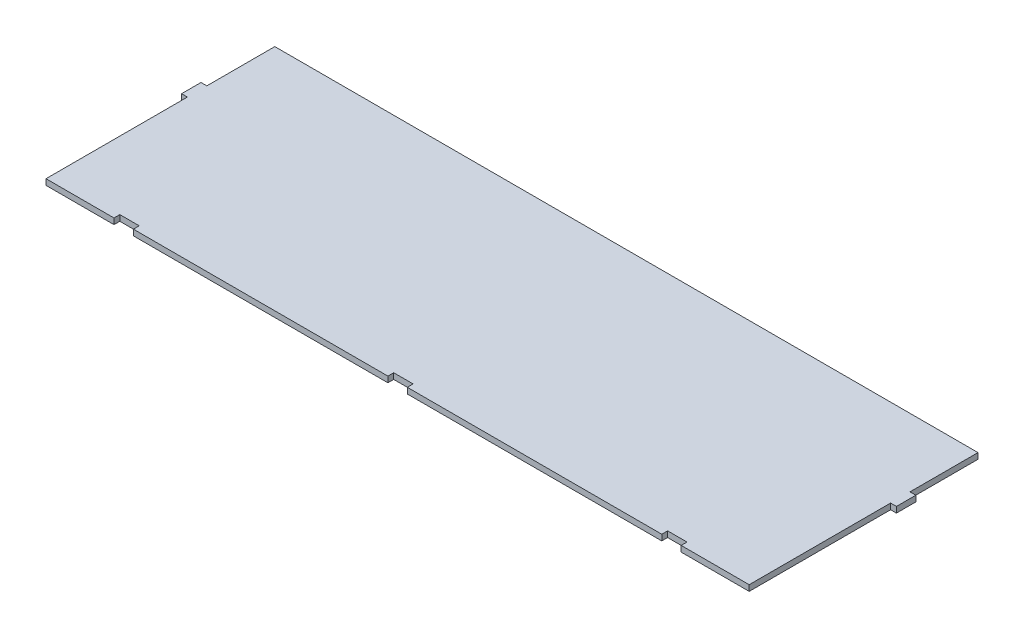
ISO-10303-21;
HEADER;
FILE_DESCRIPTION(('STEP AP214'),'2;1');
FILE_NAME('part.step','',(''),(''),'','','');
FILE_SCHEMA(('AUTOMOTIVE_DESIGN { 1 0 10303 214 1 1 1 1 }'));
ENDSEC;
DATA;
#1=APPLICATION_CONTEXT('core data for automotive mechanical design processes');
#2=APPLICATION_PROTOCOL_DEFINITION('international standard','automotive_design',2000,#1);
#3=PRODUCT_CONTEXT('',#1,'mechanical');
#4=PRODUCT('Part','Part','',(#3));
#5=PRODUCT_RELATED_PRODUCT_CATEGORY('part','',(#4));
#6=PRODUCT_DEFINITION_FORMATION('','',#4);
#7=PRODUCT_DEFINITION_CONTEXT('part definition',#1,'design');
#8=PRODUCT_DEFINITION('design','',#6,#7);
#9=PRODUCT_DEFINITION_SHAPE('','',#8);
#10=(LENGTH_UNIT() NAMED_UNIT(*) SI_UNIT(.MILLI.,.METRE.));
#11=(NAMED_UNIT(*) PLANE_ANGLE_UNIT() SI_UNIT($,.RADIAN.));
#12=(NAMED_UNIT(*) SI_UNIT($,.STERADIAN.) SOLID_ANGLE_UNIT());
#13=UNCERTAINTY_MEASURE_WITH_UNIT(LENGTH_MEASURE(1.E-05),#10,'distance_accuracy_value','');
#14=(GEOMETRIC_REPRESENTATION_CONTEXT(3) GLOBAL_UNCERTAINTY_ASSIGNED_CONTEXT((#13)) GLOBAL_UNIT_ASSIGNED_CONTEXT((#10,
#11,#12)) REPRESENTATION_CONTEXT('',''));
#15=CARTESIAN_POINT('',(0.,0.,0.));
#16=DIRECTION('',(0.,0.,1.));
#17=DIRECTION('',(1.,0.,0.));
#18=AXIS2_PLACEMENT_3D('',#15,#16,#17);
#19=CARTESIAN_POINT('',(-146.,3.,49.095));
#20=DIRECTION('',(0.,0.,-1.));
#21=DIRECTION('',(-1.,0.,0.));
#22=AXIS2_PLACEMENT_3D('',#19,#20,#21);
#23=PLANE('',#22);
#24=DIRECTION('',(1.,0.,0.));
#25=VECTOR('',#24,1.);
#26=CARTESIAN_POINT('',(-146.,0.,49.095));
#27=LINE('',#26,#25);
#28=CARTESIAN_POINT('',(-181.,0.,49.095));
#29=VERTEX_POINT('',#28);
#30=CARTESIAN_POINT('',(-146.,0.,49.095));
#31=VERTEX_POINT('',#30);
#32=EDGE_CURVE('E228',#29,#31,#27,.T.);
#33=ORIENTED_EDGE('',*,*,#32,.T.);
#34=DIRECTION('',(0.,-1.,0.));
#35=VECTOR('',#34,1.);
#36=CARTESIAN_POINT('',(-146.,3.,49.095));
#37=LINE('',#36,#35);
#38=CARTESIAN_POINT('',(-146.,3.,49.095));
#39=VERTEX_POINT('',#38);
#40=EDGE_CURVE('E11',#39,#31,#37,.T.);
#41=ORIENTED_EDGE('',*,*,#40,.F.);
#42=DIRECTION('',(1.,0.,0.));
#43=VECTOR('',#42,1.);
#44=CARTESIAN_POINT('',(-146.,3.,49.095));
#45=LINE('',#44,#43);
#46=CARTESIAN_POINT('',(-181.,3.,49.095));
#47=VERTEX_POINT('',#46);
#48=EDGE_CURVE('E274',#47,#39,#45,.T.);
#49=ORIENTED_EDGE('',*,*,#48,.F.);
#50=DIRECTION('',(0.,-1.,0.));
#51=VECTOR('',#50,1.);
#52=CARTESIAN_POINT('',(-181.,3.,49.095));
#53=LINE('',#52,#51);
#54=EDGE_CURVE('E224',#47,#29,#53,.T.);
#55=ORIENTED_EDGE('',*,*,#54,.T.);
#56=EDGE_LOOP('',(#33,#41,#49,#55));
#57=FACE_BOUND('',#56,.T.);
#58=ADVANCED_FACE('F36',(#57),#23,.F.);
#59=CARTESIAN_POINT('',(-146.,3.,49.095));
#60=DIRECTION('',(-1.,0.,0.));
#61=DIRECTION('',(0.,0.,1.));
#62=AXIS2_PLACEMENT_3D('',#59,#60,#61);
#63=PLANE('',#62);
#64=DIRECTION('',(0.,0.,-1.));
#65=VECTOR('',#64,1.);
#66=CARTESIAN_POINT('',(-146.,0.,49.095));
#67=LINE('',#66,#65);
#68=CARTESIAN_POINT('',(-146.,0.,46.095));
#69=VERTEX_POINT('',#68);
#70=EDGE_CURVE('E231',#31,#69,#67,.T.);
#71=ORIENTED_EDGE('',*,*,#70,.T.);
#72=DIRECTION('',(0.,-1.,0.));
#73=VECTOR('',#72,1.);
#74=CARTESIAN_POINT('',(-146.,3.,46.095));
#75=LINE('',#74,#73);
#76=CARTESIAN_POINT('',(-146.,3.,46.095));
#77=VERTEX_POINT('',#76);
#78=EDGE_CURVE('E44',#77,#69,#75,.T.);
#79=ORIENTED_EDGE('',*,*,#78,.F.);
#80=DIRECTION('',(0.,0.,-1.));
#81=VECTOR('',#80,1.);
#82=CARTESIAN_POINT('',(-146.,3.,49.095));
#83=LINE('',#82,#81);
#84=EDGE_CURVE('E143',#39,#77,#83,.T.);
#85=ORIENTED_EDGE('',*,*,#84,.F.);
#86=ORIENTED_EDGE('',*,*,#40,.T.);
#87=EDGE_LOOP('',(#71,#79,#85,#86));
#88=FACE_BOUND('',#87,.T.);
#89=ADVANCED_FACE('F412',(#88),#63,.F.);
#90=CARTESIAN_POINT('',(-146.,3.,46.095));
#91=DIRECTION('',(0.,0.,-1.));
#92=DIRECTION('',(-1.,0.,0.));
#93=AXIS2_PLACEMENT_3D('',#90,#91,#92);
#94=PLANE('',#93);
#95=DIRECTION('',(1.,0.,0.));
#96=VECTOR('',#95,1.);
#97=CARTESIAN_POINT('',(-146.,0.,46.095));
#98=LINE('',#97,#96);
#99=CARTESIAN_POINT('',(-136.,0.,46.095));
#100=VERTEX_POINT('',#99);
#101=EDGE_CURVE('E233',#69,#100,#98,.T.);
#102=ORIENTED_EDGE('',*,*,#101,.T.);
#103=DIRECTION('',(0.,-1.,0.));
#104=VECTOR('',#103,1.);
#105=CARTESIAN_POINT('',(-136.,3.,46.095));
#106=LINE('',#105,#104);
#107=CARTESIAN_POINT('',(-136.,3.,46.095));
#108=VERTEX_POINT('',#107);
#109=EDGE_CURVE('E329',#108,#100,#106,.T.);
#110=ORIENTED_EDGE('',*,*,#109,.F.);
#111=DIRECTION('',(1.,0.,0.));
#112=VECTOR('',#111,1.);
#113=CARTESIAN_POINT('',(-146.,3.,46.095));
#114=LINE('',#113,#112);
#115=EDGE_CURVE('E337',#77,#108,#114,.T.);
#116=ORIENTED_EDGE('',*,*,#115,.F.);
#117=ORIENTED_EDGE('',*,*,#78,.T.);
#118=EDGE_LOOP('',(#102,#110,#116,#117));
#119=FACE_BOUND('',#118,.T.);
#120=ADVANCED_FACE('F335',(#119),#94,.F.);
#121=CARTESIAN_POINT('',(-136.,3.,46.095));
#122=DIRECTION('',(1.,0.,0.));
#123=DIRECTION('',(0.,0.,-1.));
#124=AXIS2_PLACEMENT_3D('',#121,#122,#123);
#125=PLANE('',#124);
#126=DIRECTION('',(0.,0.,1.));
#127=VECTOR('',#126,1.);
#128=CARTESIAN_POINT('',(-136.,0.,46.095));
#129=LINE('',#128,#127);
#130=CARTESIAN_POINT('',(-136.,0.,49.095));
#131=VERTEX_POINT('',#130);
#132=EDGE_CURVE('E235',#100,#131,#129,.T.);
#133=ORIENTED_EDGE('',*,*,#132,.T.);
#134=DIRECTION('',(0.,-1.,0.));
#135=VECTOR('',#134,1.);
#136=CARTESIAN_POINT('',(-136.,3.,49.095));
#137=LINE('',#136,#135);
#138=CARTESIAN_POINT('',(-136.,3.,49.095));
#139=VERTEX_POINT('',#138);
#140=EDGE_CURVE('E326',#139,#131,#137,.T.);
#141=ORIENTED_EDGE('',*,*,#140,.F.);
#142=DIRECTION('',(0.,0.,1.));
#143=VECTOR('',#142,1.);
#144=CARTESIAN_POINT('',(-136.,3.,46.095));
#145=LINE('',#144,#143);
#146=EDGE_CURVE('E355',#108,#139,#145,.T.);
#147=ORIENTED_EDGE('',*,*,#146,.F.);
#148=ORIENTED_EDGE('',*,*,#109,.T.);
#149=EDGE_LOOP('',(#133,#141,#147,#148));
#150=FACE_BOUND('',#149,.T.);
#151=ADVANCED_FACE('F346',(#150),#125,.F.);
#152=CARTESIAN_POINT('',(-5.00000000000006,3.,49.095));
#153=DIRECTION('',(0.,0.,-1.));
#154=DIRECTION('',(-1.,0.,0.));
#155=AXIS2_PLACEMENT_3D('',#152,#153,#154);
#156=PLANE('',#155);
#157=DIRECTION('',(1.,0.,0.));
#158=VECTOR('',#157,1.);
#159=CARTESIAN_POINT('',(-5.00000000000006,0.,49.095));
#160=LINE('',#159,#158);
#161=CARTESIAN_POINT('',(-5.00000000000006,0.,49.095));
#162=VERTEX_POINT('',#161);
#163=EDGE_CURVE('E237',#131,#162,#160,.T.);
#164=ORIENTED_EDGE('',*,*,#163,.T.);
#165=DIRECTION('',(0.,-1.,0.));
#166=VECTOR('',#165,1.);
#167=CARTESIAN_POINT('',(-5.00000000000006,3.,49.095));
#168=LINE('',#167,#166);
#169=CARTESIAN_POINT('',(-5.00000000000006,3.,49.095));
#170=VERTEX_POINT('',#169);
#171=EDGE_CURVE('E323',#170,#162,#168,.T.);
#172=ORIENTED_EDGE('',*,*,#171,.F.);
#173=DIRECTION('',(1.,0.,0.));
#174=VECTOR('',#173,1.);
#175=CARTESIAN_POINT('',(-5.00000000000006,3.,49.095));
#176=LINE('',#175,#174);
#177=EDGE_CURVE('E352',#139,#170,#176,.T.);
#178=ORIENTED_EDGE('',*,*,#177,.F.);
#179=ORIENTED_EDGE('',*,*,#140,.T.);
#180=EDGE_LOOP('',(#164,#172,#178,#179));
#181=FACE_BOUND('',#180,.T.);
#182=ADVANCED_FACE('F350',(#181),#156,.F.);
#183=CARTESIAN_POINT('',(-5.00000000000006,3.,46.095));
#184=DIRECTION('',(-1.,0.,0.));
#185=DIRECTION('',(0.,0.,1.));
#186=AXIS2_PLACEMENT_3D('',#183,#184,#185);
#187=PLANE('',#186);
#188=DIRECTION('',(0.,0.,-1.));
#189=VECTOR('',#188,1.);
#190=CARTESIAN_POINT('',(-5.00000000000006,0.,46.095));
#191=LINE('',#190,#189);
#192=CARTESIAN_POINT('',(-5.00000000000006,0.,46.095));
#193=VERTEX_POINT('',#192);
#194=EDGE_CURVE('E239',#162,#193,#191,.T.);
#195=ORIENTED_EDGE('',*,*,#194,.T.);
#196=DIRECTION('',(0.,-1.,0.));
#197=VECTOR('',#196,1.);
#198=CARTESIAN_POINT('',(-5.00000000000006,3.,46.095));
#199=LINE('',#198,#197);
#200=CARTESIAN_POINT('',(-5.00000000000006,3.,46.095));
#201=VERTEX_POINT('',#200);
#202=EDGE_CURVE('E320',#201,#193,#199,.T.);
#203=ORIENTED_EDGE('',*,*,#202,.F.);
#204=DIRECTION('',(0.,0.,-1.));
#205=VECTOR('',#204,1.);
#206=CARTESIAN_POINT('',(-5.00000000000006,3.,46.095));
#207=LINE('',#206,#205);
#208=EDGE_CURVE('E354',#170,#201,#207,.T.);
#209=ORIENTED_EDGE('',*,*,#208,.F.);
#210=ORIENTED_EDGE('',*,*,#171,.T.);
#211=EDGE_LOOP('',(#195,#203,#209,#210));
#212=FACE_BOUND('',#211,.T.);
#213=ADVANCED_FACE('F425',(#212),#187,.F.);
#214=CARTESIAN_POINT('',(-5.00000000000006,3.,46.095));
#215=DIRECTION('',(0.,0.,-1.));
#216=DIRECTION('',(-1.,0.,0.));
#217=AXIS2_PLACEMENT_3D('',#214,#215,#216);
#218=PLANE('',#217);
#219=DIRECTION('',(1.,0.,0.));
#220=VECTOR('',#219,1.);
#221=CARTESIAN_POINT('',(-5.00000000000006,0.,46.095));
#222=LINE('',#221,#220);
#223=CARTESIAN_POINT('',(4.99999999999994,0.,46.095));
#224=VERTEX_POINT('',#223);
#225=EDGE_CURVE('E241',#193,#224,#222,.T.);
#226=ORIENTED_EDGE('',*,*,#225,.T.);
#227=DIRECTION('',(0.,-1.,0.));
#228=VECTOR('',#227,1.);
#229=CARTESIAN_POINT('',(4.99999999999994,3.,46.095));
#230=LINE('',#229,#228);
#231=CARTESIAN_POINT('',(4.99999999999994,3.,46.095));
#232=VERTEX_POINT('',#231);
#233=EDGE_CURVE('E317',#232,#224,#230,.T.);
#234=ORIENTED_EDGE('',*,*,#233,.F.);
#235=DIRECTION('',(1.,0.,0.));
#236=VECTOR('',#235,1.);
#237=CARTESIAN_POINT('',(-5.00000000000006,3.,46.095));
#238=LINE('',#237,#236);
#239=EDGE_CURVE('E357',#201,#232,#238,.T.);
#240=ORIENTED_EDGE('',*,*,#239,.F.);
#241=ORIENTED_EDGE('',*,*,#202,.T.);
#242=EDGE_LOOP('',(#226,#234,#240,#241));
#243=FACE_BOUND('',#242,.T.);
#244=ADVANCED_FACE('F428',(#243),#218,.F.);
#245=CARTESIAN_POINT('',(4.99999999999994,3.,46.095));
#246=DIRECTION('',(1.,0.,0.));
#247=DIRECTION('',(0.,0.,-1.));
#248=AXIS2_PLACEMENT_3D('',#245,#246,#247);
#249=PLANE('',#248);
#250=DIRECTION('',(0.,0.,1.));
#251=VECTOR('',#250,1.);
#252=CARTESIAN_POINT('',(4.99999999999994,0.,46.095));
#253=LINE('',#252,#251);
#254=CARTESIAN_POINT('',(4.99999999999994,0.,49.095));
#255=VERTEX_POINT('',#254);
#256=EDGE_CURVE('E243',#224,#255,#253,.T.);
#257=ORIENTED_EDGE('',*,*,#256,.T.);
#258=DIRECTION('',(0.,-1.,0.));
#259=VECTOR('',#258,1.);
#260=CARTESIAN_POINT('',(4.99999999999994,3.,49.095));
#261=LINE('',#260,#259);
#262=CARTESIAN_POINT('',(4.99999999999994,3.,49.095));
#263=VERTEX_POINT('',#262);
#264=EDGE_CURVE('E314',#263,#255,#261,.T.);
#265=ORIENTED_EDGE('',*,*,#264,.F.);
#266=DIRECTION('',(0.,0.,1.));
#267=VECTOR('',#266,1.);
#268=CARTESIAN_POINT('',(4.99999999999994,3.,46.095));
#269=LINE('',#268,#267);
#270=EDGE_CURVE('E363',#232,#263,#269,.T.);
#271=ORIENTED_EDGE('',*,*,#270,.F.);
#272=ORIENTED_EDGE('',*,*,#233,.T.);
#273=EDGE_LOOP('',(#257,#265,#271,#272));
#274=FACE_BOUND('',#273,.T.);
#275=ADVANCED_FACE('F432',(#274),#249,.F.);
#276=CARTESIAN_POINT('',(136.,3.,49.095));
#277=DIRECTION('',(0.,0.,-1.));
#278=DIRECTION('',(-1.,0.,0.));
#279=AXIS2_PLACEMENT_3D('',#276,#277,#278);
#280=PLANE('',#279);
#281=DIRECTION('',(1.,0.,0.));
#282=VECTOR('',#281,1.);
#283=CARTESIAN_POINT('',(136.,0.,49.095));
#284=LINE('',#283,#282);
#285=CARTESIAN_POINT('',(136.,0.,49.095));
#286=VERTEX_POINT('',#285);
#287=EDGE_CURVE('E245',#255,#286,#284,.T.);
#288=ORIENTED_EDGE('',*,*,#287,.T.);
#289=DIRECTION('',(0.,-1.,0.));
#290=VECTOR('',#289,1.);
#291=CARTESIAN_POINT('',(136.,3.,49.095));
#292=LINE('',#291,#290);
#293=CARTESIAN_POINT('',(136.,3.,49.095));
#294=VERTEX_POINT('',#293);
#295=EDGE_CURVE('E311',#294,#286,#292,.T.);
#296=ORIENTED_EDGE('',*,*,#295,.F.);
#297=DIRECTION('',(1.,0.,0.));
#298=VECTOR('',#297,1.);
#299=CARTESIAN_POINT('',(136.,3.,49.095));
#300=LINE('',#299,#298);
#301=EDGE_CURVE('E365',#263,#294,#300,.T.);
#302=ORIENTED_EDGE('',*,*,#301,.F.);
#303=ORIENTED_EDGE('',*,*,#264,.T.);
#304=EDGE_LOOP('',(#288,#296,#302,#303));
#305=FACE_BOUND('',#304,.T.);
#306=ADVANCED_FACE('F436',(#305),#280,.F.);
#307=CARTESIAN_POINT('',(136.,3.,46.095));
#308=DIRECTION('',(-1.,0.,0.));
#309=DIRECTION('',(0.,0.,1.));
#310=AXIS2_PLACEMENT_3D('',#307,#308,#309);
#311=PLANE('',#310);
#312=DIRECTION('',(0.,0.,-1.));
#313=VECTOR('',#312,1.);
#314=CARTESIAN_POINT('',(136.,0.,46.095));
#315=LINE('',#314,#313);
#316=CARTESIAN_POINT('',(136.,0.,46.095));
#317=VERTEX_POINT('',#316);
#318=EDGE_CURVE('E247',#286,#317,#315,.T.);
#319=ORIENTED_EDGE('',*,*,#318,.T.);
#320=DIRECTION('',(0.,-1.,0.));
#321=VECTOR('',#320,1.);
#322=CARTESIAN_POINT('',(136.,3.,46.095));
#323=LINE('',#322,#321);
#324=CARTESIAN_POINT('',(136.,3.,46.095));
#325=VERTEX_POINT('',#324);
#326=EDGE_CURVE('E308',#325,#317,#323,.T.);
#327=ORIENTED_EDGE('',*,*,#326,.F.);
#328=DIRECTION('',(0.,0.,-1.));
#329=VECTOR('',#328,1.);
#330=CARTESIAN_POINT('',(136.,3.,46.095));
#331=LINE('',#330,#329);
#332=EDGE_CURVE('E367',#294,#325,#331,.T.);
#333=ORIENTED_EDGE('',*,*,#332,.F.);
#334=ORIENTED_EDGE('',*,*,#295,.T.);
#335=EDGE_LOOP('',(#319,#327,#333,#334));
#336=FACE_BOUND('',#335,.T.);
#337=ADVANCED_FACE('F440',(#336),#311,.F.);
#338=CARTESIAN_POINT('',(146.,3.,46.095));
#339=DIRECTION('',(0.,0.,-1.));
#340=DIRECTION('',(-1.,0.,0.));
#341=AXIS2_PLACEMENT_3D('',#338,#339,#340);
#342=PLANE('',#341);
#343=DIRECTION('',(1.,0.,0.));
#344=VECTOR('',#343,1.);
#345=CARTESIAN_POINT('',(146.,0.,46.095));
#346=LINE('',#345,#344);
#347=CARTESIAN_POINT('',(146.,0.,46.095));
#348=VERTEX_POINT('',#347);
#349=EDGE_CURVE('E249',#317,#348,#346,.T.);
#350=ORIENTED_EDGE('',*,*,#349,.T.);
#351=DIRECTION('',(0.,-1.,0.));
#352=VECTOR('',#351,1.);
#353=CARTESIAN_POINT('',(146.,3.,46.095));
#354=LINE('',#353,#352);
#355=CARTESIAN_POINT('',(146.,3.,46.095));
#356=VERTEX_POINT('',#355);
#357=EDGE_CURVE('E305',#356,#348,#354,.T.);
#358=ORIENTED_EDGE('',*,*,#357,.F.);
#359=DIRECTION('',(1.,0.,0.));
#360=VECTOR('',#359,1.);
#361=CARTESIAN_POINT('',(146.,3.,46.095));
#362=LINE('',#361,#360);
#363=EDGE_CURVE('E369',#325,#356,#362,.T.);
#364=ORIENTED_EDGE('',*,*,#363,.F.);
#365=ORIENTED_EDGE('',*,*,#326,.T.);
#366=EDGE_LOOP('',(#350,#358,#364,#365));
#367=FACE_BOUND('',#366,.T.);
#368=ADVANCED_FACE('F444',(#367),#342,.F.);
#369=CARTESIAN_POINT('',(146.,3.,49.095));
#370=DIRECTION('',(1.,0.,0.));
#371=DIRECTION('',(0.,0.,-1.));
#372=AXIS2_PLACEMENT_3D('',#369,#370,#371);
#373=PLANE('',#372);
#374=DIRECTION('',(0.,0.,1.));
#375=VECTOR('',#374,1.);
#376=CARTESIAN_POINT('',(146.,0.,49.095));
#377=LINE('',#376,#375);
#378=CARTESIAN_POINT('',(146.,0.,49.095));
#379=VERTEX_POINT('',#378);
#380=EDGE_CURVE('E251',#348,#379,#377,.T.);
#381=ORIENTED_EDGE('',*,*,#380,.T.);
#382=DIRECTION('',(0.,-1.,0.));
#383=VECTOR('',#382,1.);
#384=CARTESIAN_POINT('',(146.,3.,49.095));
#385=LINE('',#384,#383);
#386=CARTESIAN_POINT('',(146.,3.,49.095));
#387=VERTEX_POINT('',#386);
#388=EDGE_CURVE('E302',#387,#379,#385,.T.);
#389=ORIENTED_EDGE('',*,*,#388,.F.);
#390=DIRECTION('',(0.,0.,1.));
#391=VECTOR('',#390,1.);
#392=CARTESIAN_POINT('',(146.,3.,49.095));
#393=LINE('',#392,#391);
#394=EDGE_CURVE('E371',#356,#387,#393,.T.);
#395=ORIENTED_EDGE('',*,*,#394,.F.);
#396=ORIENTED_EDGE('',*,*,#357,.T.);
#397=EDGE_LOOP('',(#381,#389,#395,#396));
#398=FACE_BOUND('',#397,.T.);
#399=ADVANCED_FACE('F448',(#398),#373,.F.);
#400=CARTESIAN_POINT('',(181.,3.,49.095));
#401=DIRECTION('',(0.,0.,-1.));
#402=DIRECTION('',(-1.,0.,0.));
#403=AXIS2_PLACEMENT_3D('',#400,#401,#402);
#404=PLANE('',#403);
#405=DIRECTION('',(1.,0.,0.));
#406=VECTOR('',#405,1.);
#407=CARTESIAN_POINT('',(181.,0.,49.095));
#408=LINE('',#407,#406);
#409=CARTESIAN_POINT('',(181.,0.,49.095));
#410=VERTEX_POINT('',#409);
#411=EDGE_CURVE('E253',#379,#410,#408,.T.);
#412=ORIENTED_EDGE('',*,*,#411,.T.);
#413=DIRECTION('',(0.,-1.,0.));
#414=VECTOR('',#413,1.);
#415=CARTESIAN_POINT('',(181.,3.,49.095));
#416=LINE('',#415,#414);
#417=CARTESIAN_POINT('',(181.,3.,49.095));
#418=VERTEX_POINT('',#417);
#419=EDGE_CURVE('E299',#418,#410,#416,.T.);
#420=ORIENTED_EDGE('',*,*,#419,.F.);
#421=DIRECTION('',(1.,0.,0.));
#422=VECTOR('',#421,1.);
#423=CARTESIAN_POINT('',(181.,3.,49.095));
#424=LINE('',#423,#422);
#425=EDGE_CURVE('E373',#387,#418,#424,.T.);
#426=ORIENTED_EDGE('',*,*,#425,.F.);
#427=ORIENTED_EDGE('',*,*,#388,.T.);
#428=EDGE_LOOP('',(#412,#420,#426,#427));
#429=FACE_BOUND('',#428,.T.);
#430=ADVANCED_FACE('F452',(#429),#404,.F.);
#431=CARTESIAN_POINT('',(181.,3.,-23.695));
#432=DIRECTION('',(-1.,0.,0.));
#433=DIRECTION('',(0.,0.,1.));
#434=AXIS2_PLACEMENT_3D('',#431,#432,#433);
#435=PLANE('',#434);
#436=DIRECTION('',(0.,0.,-1.));
#437=VECTOR('',#436,1.);
#438=CARTESIAN_POINT('',(181.,0.,-23.695));
#439=LINE('',#438,#437);
#440=CARTESIAN_POINT('',(181.,0.,-23.695));
#441=VERTEX_POINT('',#440);
#442=EDGE_CURVE('E255',#410,#441,#439,.T.);
#443=ORIENTED_EDGE('',*,*,#442,.T.);
#444=DIRECTION('',(0.,-1.,0.));
#445=VECTOR('',#444,1.);
#446=CARTESIAN_POINT('',(181.,3.,-23.695));
#447=LINE('',#446,#445);
#448=CARTESIAN_POINT('',(181.,3.,-23.695));
#449=VERTEX_POINT('',#448);
#450=EDGE_CURVE('E296',#449,#441,#447,.T.);
#451=ORIENTED_EDGE('',*,*,#450,.F.);
#452=DIRECTION('',(0.,0.,-1.));
#453=VECTOR('',#452,1.);
#454=CARTESIAN_POINT('',(181.,3.,-23.695));
#455=LINE('',#454,#453);
#456=EDGE_CURVE('E375',#418,#449,#455,.T.);
#457=ORIENTED_EDGE('',*,*,#456,.F.);
#458=ORIENTED_EDGE('',*,*,#419,.T.);
#459=EDGE_LOOP('',(#443,#451,#457,#458));
#460=FACE_BOUND('',#459,.T.);
#461=ADVANCED_FACE('F456',(#460),#435,.F.);
#462=CARTESIAN_POINT('',(181.,3.,-23.695));
#463=DIRECTION('',(0.,0.,-1.));
#464=DIRECTION('',(-1.,0.,0.));
#465=AXIS2_PLACEMENT_3D('',#462,#463,#464);
#466=PLANE('',#465);
#467=DIRECTION('',(1.,0.,0.));
#468=VECTOR('',#467,1.);
#469=CARTESIAN_POINT('',(181.,0.,-23.695));
#470=LINE('',#469,#468);
#471=CARTESIAN_POINT('',(184.,0.,-23.695));
#472=VERTEX_POINT('',#471);
#473=EDGE_CURVE('E257',#441,#472,#470,.T.);
#474=ORIENTED_EDGE('',*,*,#473,.T.);
#475=DIRECTION('',(0.,-1.,0.));
#476=VECTOR('',#475,1.);
#477=CARTESIAN_POINT('',(184.,3.,-23.695));
#478=LINE('',#477,#476);
#479=CARTESIAN_POINT('',(184.,3.,-23.695));
#480=VERTEX_POINT('',#479);
#481=EDGE_CURVE('E293',#480,#472,#478,.T.);
#482=ORIENTED_EDGE('',*,*,#481,.F.);
#483=DIRECTION('',(1.,0.,0.));
#484=VECTOR('',#483,1.);
#485=CARTESIAN_POINT('',(181.,3.,-23.695));
#486=LINE('',#485,#484);
#487=EDGE_CURVE('E377',#449,#480,#486,.T.);
#488=ORIENTED_EDGE('',*,*,#487,.F.);
#489=ORIENTED_EDGE('',*,*,#450,.T.);
#490=EDGE_LOOP('',(#474,#482,#488,#489));
#491=FACE_BOUND('',#490,.T.);
#492=ADVANCED_FACE('F460',(#491),#466,.F.);
#493=CARTESIAN_POINT('',(184.,3.,-33.695));
#494=DIRECTION('',(-1.,0.,0.));
#495=DIRECTION('',(0.,0.,1.));
#496=AXIS2_PLACEMENT_3D('',#493,#494,#495);
#497=PLANE('',#496);
#498=DIRECTION('',(0.,0.,-1.));
#499=VECTOR('',#498,1.);
#500=CARTESIAN_POINT('',(184.,0.,-33.695));
#501=LINE('',#500,#499);
#502=CARTESIAN_POINT('',(184.,0.,-33.695));
#503=VERTEX_POINT('',#502);
#504=EDGE_CURVE('E259',#472,#503,#501,.T.);
#505=ORIENTED_EDGE('',*,*,#504,.T.);
#506=DIRECTION('',(0.,-1.,0.));
#507=VECTOR('',#506,1.);
#508=CARTESIAN_POINT('',(184.,3.,-33.695));
#509=LINE('',#508,#507);
#510=CARTESIAN_POINT('',(184.,3.,-33.695));
#511=VERTEX_POINT('',#510);
#512=EDGE_CURVE('E290',#511,#503,#509,.T.);
#513=ORIENTED_EDGE('',*,*,#512,.F.);
#514=DIRECTION('',(0.,0.,-1.));
#515=VECTOR('',#514,1.);
#516=CARTESIAN_POINT('',(184.,3.,-33.695));
#517=LINE('',#516,#515);
#518=EDGE_CURVE('E379',#480,#511,#517,.T.);
#519=ORIENTED_EDGE('',*,*,#518,.F.);
#520=ORIENTED_EDGE('',*,*,#481,.T.);
#521=EDGE_LOOP('',(#505,#513,#519,#520));
#522=FACE_BOUND('',#521,.T.);
#523=ADVANCED_FACE('F464',(#522),#497,.F.);
#524=CARTESIAN_POINT('',(184.,3.,-33.695));
#525=DIRECTION('',(0.,0.,1.));
#526=DIRECTION('',(1.,0.,0.));
#527=AXIS2_PLACEMENT_3D('',#524,#525,#526);
#528=PLANE('',#527);
#529=DIRECTION('',(-1.,0.,0.));
#530=VECTOR('',#529,1.);
#531=CARTESIAN_POINT('',(184.,0.,-33.695));
#532=LINE('',#531,#530);
#533=CARTESIAN_POINT('',(181.,0.,-33.695));
#534=VERTEX_POINT('',#533);
#535=EDGE_CURVE('E261',#503,#534,#532,.T.);
#536=ORIENTED_EDGE('',*,*,#535,.T.);
#537=DIRECTION('',(0.,-1.,0.));
#538=VECTOR('',#537,1.);
#539=CARTESIAN_POINT('',(181.,3.,-33.695));
#540=LINE('',#539,#538);
#541=CARTESIAN_POINT('',(181.,3.,-33.695));
#542=VERTEX_POINT('',#541);
#543=EDGE_CURVE('E287',#542,#534,#540,.T.);
#544=ORIENTED_EDGE('',*,*,#543,.F.);
#545=DIRECTION('',(-1.,0.,0.));
#546=VECTOR('',#545,1.);
#547=CARTESIAN_POINT('',(184.,3.,-33.695));
#548=LINE('',#547,#546);
#549=EDGE_CURVE('E381',#511,#542,#548,.T.);
#550=ORIENTED_EDGE('',*,*,#549,.F.);
#551=ORIENTED_EDGE('',*,*,#512,.T.);
#552=EDGE_LOOP('',(#536,#544,#550,#551));
#553=FACE_BOUND('',#552,.T.);
#554=ADVANCED_FACE('F468',(#553),#528,.F.);
#555=CARTESIAN_POINT('',(181.,3.,-68.695));
#556=DIRECTION('',(-1.,0.,0.));
#557=DIRECTION('',(0.,0.,1.));
#558=AXIS2_PLACEMENT_3D('',#555,#556,#557);
#559=PLANE('',#558);
#560=DIRECTION('',(0.,0.,-1.));
#561=VECTOR('',#560,1.);
#562=CARTESIAN_POINT('',(181.,0.,-68.695));
#563=LINE('',#562,#561);
#564=CARTESIAN_POINT('',(181.,0.,-68.695));
#565=VERTEX_POINT('',#564);
#566=EDGE_CURVE('E263',#534,#565,#563,.T.);
#567=ORIENTED_EDGE('',*,*,#566,.T.);
#568=DIRECTION('',(0.,-1.,0.));
#569=VECTOR('',#568,1.);
#570=CARTESIAN_POINT('',(181.,3.,-68.695));
#571=LINE('',#570,#569);
#572=CARTESIAN_POINT('',(181.,3.,-68.695));
#573=VERTEX_POINT('',#572);
#574=EDGE_CURVE('E284',#573,#565,#571,.T.);
#575=ORIENTED_EDGE('',*,*,#574,.F.);
#576=DIRECTION('',(0.,0.,-1.));
#577=VECTOR('',#576,1.);
#578=CARTESIAN_POINT('',(181.,3.,-68.695));
#579=LINE('',#578,#577);
#580=EDGE_CURVE('E383',#542,#573,#579,.T.);
#581=ORIENTED_EDGE('',*,*,#580,.F.);
#582=ORIENTED_EDGE('',*,*,#543,.T.);
#583=EDGE_LOOP('',(#567,#575,#581,#582));
#584=FACE_BOUND('',#583,.T.);
#585=ADVANCED_FACE('F472',(#584),#559,.F.);
#586=CARTESIAN_POINT('',(181.,3.,-68.695));
#587=DIRECTION('',(0.,0.,1.));
#588=DIRECTION('',(1.,0.,0.));
#589=AXIS2_PLACEMENT_3D('',#586,#587,#588);
#590=PLANE('',#589);
#591=DIRECTION('',(-1.,0.,0.));
#592=VECTOR('',#591,1.);
#593=CARTESIAN_POINT('',(181.,0.,-68.695));
#594=LINE('',#593,#592);
#595=CARTESIAN_POINT('',(-181.,0.,-68.695));
#596=VERTEX_POINT('',#595);
#597=EDGE_CURVE('E265',#565,#596,#594,.T.);
#598=ORIENTED_EDGE('',*,*,#597,.T.);
#599=DIRECTION('',(0.,-1.,0.));
#600=VECTOR('',#599,1.);
#601=CARTESIAN_POINT('',(-181.,3.,-68.695));
#602=LINE('',#601,#600);
#603=CARTESIAN_POINT('',(-181.,3.,-68.695));
#604=VERTEX_POINT('',#603);
#605=EDGE_CURVE('E281',#604,#596,#602,.T.);
#606=ORIENTED_EDGE('',*,*,#605,.F.);
#607=DIRECTION('',(-1.,0.,0.));
#608=VECTOR('',#607,1.);
#609=CARTESIAN_POINT('',(181.,3.,-68.695));
#610=LINE('',#609,#608);
#611=EDGE_CURVE('E385',#573,#604,#610,.T.);
#612=ORIENTED_EDGE('',*,*,#611,.F.);
#613=ORIENTED_EDGE('',*,*,#574,.T.);
#614=EDGE_LOOP('',(#598,#606,#612,#613));
#615=FACE_BOUND('',#614,.T.);
#616=ADVANCED_FACE('F476',(#615),#590,.F.);
#617=CARTESIAN_POINT('',(-181.,3.,-68.695));
#618=DIRECTION('',(1.,0.,0.));
#619=DIRECTION('',(0.,0.,-1.));
#620=AXIS2_PLACEMENT_3D('',#617,#618,#619);
#621=PLANE('',#620);
#622=DIRECTION('',(0.,0.,1.));
#623=VECTOR('',#622,1.);
#624=CARTESIAN_POINT('',(-181.,0.,-68.695));
#625=LINE('',#624,#623);
#626=CARTESIAN_POINT('',(-181.,0.,-33.695));
#627=VERTEX_POINT('',#626);
#628=EDGE_CURVE('E267',#596,#627,#625,.T.);
#629=ORIENTED_EDGE('',*,*,#628,.T.);
#630=DIRECTION('',(0.,-1.,0.));
#631=VECTOR('',#630,1.);
#632=CARTESIAN_POINT('',(-181.,3.,-33.695));
#633=LINE('',#632,#631);
#634=CARTESIAN_POINT('',(-181.,3.,-33.695));
#635=VERTEX_POINT('',#634);
#636=EDGE_CURVE('E278',#635,#627,#633,.T.);
#637=ORIENTED_EDGE('',*,*,#636,.F.);
#638=DIRECTION('',(0.,0.,1.));
#639=VECTOR('',#638,1.);
#640=CARTESIAN_POINT('',(-181.,3.,-68.695));
#641=LINE('',#640,#639);
#642=EDGE_CURVE('E387',#604,#635,#641,.T.);
#643=ORIENTED_EDGE('',*,*,#642,.F.);
#644=ORIENTED_EDGE('',*,*,#605,.T.);
#645=EDGE_LOOP('',(#629,#637,#643,#644));
#646=FACE_BOUND('',#645,.T.);
#647=ADVANCED_FACE('F393',(#646),#621,.F.);
#648=CARTESIAN_POINT('',(-184.,3.,-33.695));
#649=DIRECTION('',(0.,0.,1.));
#650=DIRECTION('',(1.,0.,0.));
#651=AXIS2_PLACEMENT_3D('',#648,#649,#650);
#652=PLANE('',#651);
#653=DIRECTION('',(-1.,0.,0.));
#654=VECTOR('',#653,1.);
#655=CARTESIAN_POINT('',(-184.,0.,-33.695));
#656=LINE('',#655,#654);
#657=CARTESIAN_POINT('',(-184.,0.,-33.695));
#658=VERTEX_POINT('',#657);
#659=EDGE_CURVE('E269',#627,#658,#656,.T.);
#660=ORIENTED_EDGE('',*,*,#659,.T.);
#661=DIRECTION('',(0.,-1.,0.));
#662=VECTOR('',#661,1.);
#663=CARTESIAN_POINT('',(-184.,3.,-33.695));
#664=LINE('',#663,#662);
#665=CARTESIAN_POINT('',(-184.,3.,-33.695));
#666=VERTEX_POINT('',#665);
#667=EDGE_CURVE('E219',#666,#658,#664,.T.);
#668=ORIENTED_EDGE('',*,*,#667,.F.);
#669=DIRECTION('',(-1.,0.,0.));
#670=VECTOR('',#669,1.);
#671=CARTESIAN_POINT('',(-184.,3.,-33.695));
#672=LINE('',#671,#670);
#673=EDGE_CURVE('E210',#635,#666,#672,.T.);
#674=ORIENTED_EDGE('',*,*,#673,.F.);
#675=ORIENTED_EDGE('',*,*,#636,.T.);
#676=EDGE_LOOP('',(#660,#668,#674,#675));
#677=FACE_BOUND('',#676,.T.);
#678=ADVANCED_FACE('F397',(#677),#652,.F.);
#679=CARTESIAN_POINT('',(-184.,3.,-33.695));
#680=DIRECTION('',(1.,0.,0.));
#681=DIRECTION('',(0.,0.,-1.));
#682=AXIS2_PLACEMENT_3D('',#679,#680,#681);
#683=PLANE('',#682);
#684=DIRECTION('',(0.,0.,1.));
#685=VECTOR('',#684,1.);
#686=CARTESIAN_POINT('',(-184.,0.,-33.695));
#687=LINE('',#686,#685);
#688=CARTESIAN_POINT('',(-184.,0.,-23.695));
#689=VERTEX_POINT('',#688);
#690=EDGE_CURVE('E218',#658,#689,#687,.T.);
#691=ORIENTED_EDGE('',*,*,#690,.T.);
#692=DIRECTION('',(0.,-1.,0.));
#693=VECTOR('',#692,1.);
#694=CARTESIAN_POINT('',(-184.,3.,-23.695));
#695=LINE('',#694,#693);
#696=CARTESIAN_POINT('',(-184.,3.,-23.695));
#697=VERTEX_POINT('',#696);
#698=EDGE_CURVE('E215',#697,#689,#695,.T.);
#699=ORIENTED_EDGE('',*,*,#698,.F.);
#700=DIRECTION('',(0.,0.,1.));
#701=VECTOR('',#700,1.);
#702=CARTESIAN_POINT('',(-184.,3.,-33.695));
#703=LINE('',#702,#701);
#704=EDGE_CURVE('E204',#666,#697,#703,.T.);
#705=ORIENTED_EDGE('',*,*,#704,.F.);
#706=ORIENTED_EDGE('',*,*,#667,.T.);
#707=EDGE_LOOP('',(#691,#699,#705,#706));
#708=FACE_BOUND('',#707,.T.);
#709=ADVANCED_FACE('F216',(#708),#683,.F.);
#710=CARTESIAN_POINT('',(-181.,3.,-23.695));
#711=DIRECTION('',(0.,0.,-1.));
#712=DIRECTION('',(-1.,0.,0.));
#713=AXIS2_PLACEMENT_3D('',#710,#711,#712);
#714=PLANE('',#713);
#715=DIRECTION('',(1.,0.,0.));
#716=VECTOR('',#715,1.);
#717=CARTESIAN_POINT('',(-181.,0.,-23.695));
#718=LINE('',#717,#716);
#719=CARTESIAN_POINT('',(-181.,0.,-23.695));
#720=VERTEX_POINT('',#719);
#721=EDGE_CURVE('E129',#689,#720,#718,.T.);
#722=ORIENTED_EDGE('',*,*,#721,.T.);
#723=DIRECTION('',(0.,-1.,0.));
#724=VECTOR('',#723,1.);
#725=CARTESIAN_POINT('',(-181.,3.,-23.695));
#726=LINE('',#725,#724);
#727=CARTESIAN_POINT('',(-181.,3.,-23.695));
#728=VERTEX_POINT('',#727);
#729=EDGE_CURVE('E220',#728,#720,#726,.T.);
#730=ORIENTED_EDGE('',*,*,#729,.F.);
#731=DIRECTION('',(1.,0.,0.));
#732=VECTOR('',#731,1.);
#733=CARTESIAN_POINT('',(-181.,3.,-23.695));
#734=LINE('',#733,#732);
#735=EDGE_CURVE('E208',#697,#728,#734,.T.);
#736=ORIENTED_EDGE('',*,*,#735,.F.);
#737=ORIENTED_EDGE('',*,*,#698,.T.);
#738=EDGE_LOOP('',(#722,#730,#736,#737));
#739=FACE_BOUND('',#738,.T.);
#740=ADVANCED_FACE('F222',(#739),#714,.F.);
#741=CARTESIAN_POINT('',(-181.,3.,-23.695));
#742=DIRECTION('',(1.,0.,0.));
#743=DIRECTION('',(0.,0.,-1.));
#744=AXIS2_PLACEMENT_3D('',#741,#742,#743);
#745=PLANE('',#744);
#746=DIRECTION('',(0.,0.,1.));
#747=VECTOR('',#746,1.);
#748=CARTESIAN_POINT('',(-181.,0.,-23.695));
#749=LINE('',#748,#747);
#750=EDGE_CURVE('E135',#720,#29,#749,.T.);
#751=ORIENTED_EDGE('',*,*,#750,.T.);
#752=ORIENTED_EDGE('',*,*,#54,.F.);
#753=DIRECTION('',(0.,0.,1.));
#754=VECTOR('',#753,1.);
#755=CARTESIAN_POINT('',(-181.,3.,-23.695));
#756=LINE('',#755,#754);
#757=EDGE_CURVE('E52',#728,#47,#756,.T.);
#758=ORIENTED_EDGE('',*,*,#757,.F.);
#759=ORIENTED_EDGE('',*,*,#729,.T.);
#760=EDGE_LOOP('',(#751,#752,#758,#759));
#761=FACE_BOUND('',#760,.T.);
#762=ADVANCED_FACE('F401',(#761),#745,.F.);
#763=CARTESIAN_POINT('',(0.,3.,0.));
#764=DIRECTION('',(0.,1.,0.));
#765=DIRECTION('',(0.,0.,1.));
#766=AXIS2_PLACEMENT_3D('',#763,#764,#765);
#767=PLANE('',#766);
#768=ORIENTED_EDGE('',*,*,#48,.T.);
#769=ORIENTED_EDGE('',*,*,#84,.T.);
#770=ORIENTED_EDGE('',*,*,#115,.T.);
#771=ORIENTED_EDGE('',*,*,#146,.T.);
#772=ORIENTED_EDGE('',*,*,#177,.T.);
#773=ORIENTED_EDGE('',*,*,#208,.T.);
#774=ORIENTED_EDGE('',*,*,#239,.T.);
#775=ORIENTED_EDGE('',*,*,#270,.T.);
#776=ORIENTED_EDGE('',*,*,#301,.T.);
#777=ORIENTED_EDGE('',*,*,#332,.T.);
#778=ORIENTED_EDGE('',*,*,#363,.T.);
#779=ORIENTED_EDGE('',*,*,#394,.T.);
#780=ORIENTED_EDGE('',*,*,#425,.T.);
#781=ORIENTED_EDGE('',*,*,#456,.T.);
#782=ORIENTED_EDGE('',*,*,#487,.T.);
#783=ORIENTED_EDGE('',*,*,#518,.T.);
#784=ORIENTED_EDGE('',*,*,#549,.T.);
#785=ORIENTED_EDGE('',*,*,#580,.T.);
#786=ORIENTED_EDGE('',*,*,#611,.T.);
#787=ORIENTED_EDGE('',*,*,#642,.T.);
#788=ORIENTED_EDGE('',*,*,#673,.T.);
#789=ORIENTED_EDGE('',*,*,#704,.T.);
#790=ORIENTED_EDGE('',*,*,#735,.T.);
#791=ORIENTED_EDGE('',*,*,#757,.T.);
#792=EDGE_LOOP('',(#768,#769,#770,#771,#772,#773,#774,#775,#776,#777,#778,#779,#780,#781,#782,
#783,#784,#785,#786,#787,#788,#789,#790,#791));
#793=FACE_BOUND('',#792,.T.);
#794=ADVANCED_FACE('F206',(#793),#767,.T.);
#795=CARTESIAN_POINT('',(0.,0.,0.));
#796=DIRECTION('',(0.,1.,0.));
#797=DIRECTION('',(0.,0.,1.));
#798=AXIS2_PLACEMENT_3D('',#795,#796,#797);
#799=PLANE('',#798);
#800=ORIENTED_EDGE('',*,*,#32,.F.);
#801=ORIENTED_EDGE('',*,*,#750,.F.);
#802=ORIENTED_EDGE('',*,*,#721,.F.);
#803=ORIENTED_EDGE('',*,*,#690,.F.);
#804=ORIENTED_EDGE('',*,*,#659,.F.);
#805=ORIENTED_EDGE('',*,*,#628,.F.);
#806=ORIENTED_EDGE('',*,*,#597,.F.);
#807=ORIENTED_EDGE('',*,*,#566,.F.);
#808=ORIENTED_EDGE('',*,*,#535,.F.);
#809=ORIENTED_EDGE('',*,*,#504,.F.);
#810=ORIENTED_EDGE('',*,*,#473,.F.);
#811=ORIENTED_EDGE('',*,*,#442,.F.);
#812=ORIENTED_EDGE('',*,*,#411,.F.);
#813=ORIENTED_EDGE('',*,*,#380,.F.);
#814=ORIENTED_EDGE('',*,*,#349,.F.);
#815=ORIENTED_EDGE('',*,*,#318,.F.);
#816=ORIENTED_EDGE('',*,*,#287,.F.);
#817=ORIENTED_EDGE('',*,*,#256,.F.);
#818=ORIENTED_EDGE('',*,*,#225,.F.);
#819=ORIENTED_EDGE('',*,*,#194,.F.);
#820=ORIENTED_EDGE('',*,*,#163,.F.);
#821=ORIENTED_EDGE('',*,*,#132,.F.);
#822=ORIENTED_EDGE('',*,*,#101,.F.);
#823=ORIENTED_EDGE('',*,*,#70,.F.);
#824=EDGE_LOOP('',(#800,#801,#802,#803,#804,#805,#806,#807,#808,#809,#810,#811,#812,#813,#814,
#815,#816,#817,#818,#819,#820,#821,#822,#823));
#825=FACE_BOUND('',#824,.T.);
#826=ADVANCED_FACE('F341',(#825),#799,.F.);
#827=CLOSED_SHELL('',(#58,#89,#120,#151,#182,#213,#244,#275,#306,#337,#368,#399,#430,#461,#492,
#523,#554,#585,#616,#647,#678,#709,#740,#762,#794,#826));
#828=MANIFOLD_SOLID_BREP('B2',#827);
#829=ADVANCED_BREP_SHAPE_REPRESENTATION('',(#18,#828),#14);
#830=SHAPE_DEFINITION_REPRESENTATION(#9,#829);
ENDSEC;
END-ISO-10303-21;
